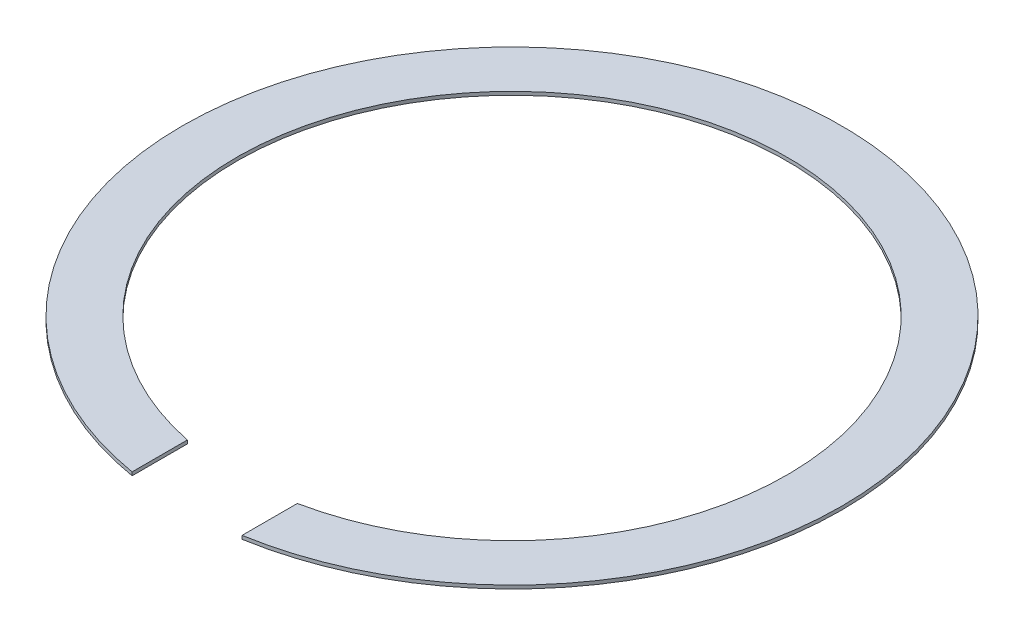
ISO-10303-21;
HEADER;
FILE_DESCRIPTION(('STEP AP214'),'2;1');
FILE_NAME('part.step','',(''),(''),'','','');
FILE_SCHEMA(('AUTOMOTIVE_DESIGN { 1 0 10303 214 1 1 1 1 }'));
ENDSEC;
DATA;
#1=APPLICATION_CONTEXT('core data for automotive mechanical design processes');
#2=APPLICATION_PROTOCOL_DEFINITION('international standard','automotive_design',2000,#1);
#3=PRODUCT_CONTEXT('',#1,'mechanical');
#4=PRODUCT('Part','Part','',(#3));
#5=PRODUCT_RELATED_PRODUCT_CATEGORY('part','',(#4));
#6=PRODUCT_DEFINITION_FORMATION('','',#4);
#7=PRODUCT_DEFINITION_CONTEXT('part definition',#1,'design');
#8=PRODUCT_DEFINITION('design','',#6,#7);
#9=PRODUCT_DEFINITION_SHAPE('','',#8);
#10=(LENGTH_UNIT() NAMED_UNIT(*) SI_UNIT(.MILLI.,.METRE.));
#11=(NAMED_UNIT(*) PLANE_ANGLE_UNIT() SI_UNIT($,.RADIAN.));
#12=(NAMED_UNIT(*) SI_UNIT($,.STERADIAN.) SOLID_ANGLE_UNIT());
#13=UNCERTAINTY_MEASURE_WITH_UNIT(LENGTH_MEASURE(1.E-05),#10,'distance_accuracy_value','');
#14=(GEOMETRIC_REPRESENTATION_CONTEXT(3) GLOBAL_UNCERTAINTY_ASSIGNED_CONTEXT((#13)) GLOBAL_UNIT_ASSIGNED_CONTEXT((#10,
#11,#12)) REPRESENTATION_CONTEXT('',''));
#15=CARTESIAN_POINT('',(0.,0.,0.));
#16=DIRECTION('',(0.,0.,1.));
#17=DIRECTION('',(1.,0.,0.));
#18=AXIS2_PLACEMENT_3D('',#15,#16,#17);
#19=CARTESIAN_POINT('',(0.,1.6002,0.));
#20=DIRECTION('',(0.,1.,0.));
#21=DIRECTION('',(0.,0.,1.));
#22=AXIS2_PLACEMENT_3D('',#19,#20,#21);
#23=PLANE('',#22);
#24=DIRECTION('',(0.,0.,-1.));
#25=VECTOR('',#24,1.);
#26=CARTESIAN_POINT('',(-25.6911112459704,1.6002,151.829236180646));
#27=LINE('',#26,#25);
#28=CARTESIAN_POINT('',(-25.6911112459694,1.6002,125.994888623298));
#29=VERTEX_POINT('',#28);
#30=CARTESIAN_POINT('',(-25.6911112459704,1.6002,151.829236180644));
#31=VERTEX_POINT('',#30);
#32=EDGE_CURVE('E69',#29,#31,#27,.F.);
#33=ORIENTED_EDGE('',*,*,#32,.F.);
#34=CARTESIAN_POINT('',(0.,1.6002,0.));
#35=DIRECTION('',(0.,1.,0.));
#36=DIRECTION('',(0.,0.,1.));
#37=AXIS2_PLACEMENT_3D('',#34,#35,#36);
#38=CIRCLE('',#37,128.5875);
#39=CARTESIAN_POINT('',(25.6911112459704,1.6002,125.994888623303));
#40=VERTEX_POINT('',#39);
#41=EDGE_CURVE('E91',#29,#40,#38,.F.);
#42=ORIENTED_EDGE('',*,*,#41,.T.);
#43=DIRECTION('',(0.,0.,1.));
#44=VECTOR('',#43,1.);
#45=CARTESIAN_POINT('',(25.6911112459704,1.6002,125.994888623308));
#46=LINE('',#45,#44);
#47=CARTESIAN_POINT('',(25.6911112459704,1.6002,151.829236180644));
#48=VERTEX_POINT('',#47);
#49=EDGE_CURVE('E83',#48,#40,#46,.F.);
#50=ORIENTED_EDGE('',*,*,#49,.F.);
#51=CARTESIAN_POINT('',(0.,1.6002,0.));
#52=DIRECTION('',(0.,1.,0.));
#53=DIRECTION('',(0.,0.,1.));
#54=AXIS2_PLACEMENT_3D('',#51,#52,#53);
#55=CIRCLE('',#54,153.9875);
#56=EDGE_CURVE('E36',#31,#48,#55,.F.);
#57=ORIENTED_EDGE('',*,*,#56,.F.);
#58=EDGE_LOOP('',(#33,#42,#50,#57));
#59=FACE_BOUND('',#58,.T.);
#60=ADVANCED_FACE('F33',(#59),#23,.T.);
#61=CARTESIAN_POINT('',(0.,0.,0.));
#62=DIRECTION('',(0.,1.,0.));
#63=DIRECTION('',(0.,0.,1.));
#64=AXIS2_PLACEMENT_3D('',#61,#62,#63);
#65=CYLINDRICAL_SURFACE('',#64,153.9875);
#66=ORIENTED_EDGE('',*,*,#56,.T.);
#67=DIRECTION('',(0.,1.,0.));
#68=VECTOR('',#67,1.);
#69=CARTESIAN_POINT('',(25.6911112459704,0.,151.829236180646));
#70=LINE('',#69,#68);
#71=CARTESIAN_POINT('',(25.6911112459704,0.,151.829236180644));
#72=VERTEX_POINT('',#71);
#73=EDGE_CURVE('E95',#72,#48,#70,.T.);
#74=ORIENTED_EDGE('',*,*,#73,.F.);
#75=CARTESIAN_POINT('',(0.,0.,0.));
#76=DIRECTION('',(0.,1.,0.));
#77=DIRECTION('',(0.,0.,1.));
#78=AXIS2_PLACEMENT_3D('',#75,#76,#77);
#79=CIRCLE('',#78,153.9875);
#80=CARTESIAN_POINT('',(-25.6911112459704,0.,151.829236180644));
#81=VERTEX_POINT('',#80);
#82=EDGE_CURVE('E89',#72,#81,#79,.T.);
#83=ORIENTED_EDGE('',*,*,#82,.T.);
#84=DIRECTION('',(0.,1.,0.));
#85=VECTOR('',#84,1.);
#86=CARTESIAN_POINT('',(-25.6911112459704,0.,151.829236180646));
#87=LINE('',#86,#85);
#88=EDGE_CURVE('E74',#31,#81,#87,.F.);
#89=ORIENTED_EDGE('',*,*,#88,.F.);
#90=EDGE_LOOP('',(#66,#74,#83,#89));
#91=FACE_BOUND('',#90,.T.);
#92=ADVANCED_FACE('F88',(#91),#65,.T.);
#93=CARTESIAN_POINT('',(-25.6911112459704,0.,151.829236180646));
#94=DIRECTION('',(1.,0.,0.));
#95=DIRECTION('',(0.,0.,-1.));
#96=AXIS2_PLACEMENT_3D('',#93,#94,#95);
#97=PLANE('',#96);
#98=ORIENTED_EDGE('',*,*,#32,.T.);
#99=ORIENTED_EDGE('',*,*,#88,.T.);
#100=DIRECTION('',(0.,0.,1.));
#101=VECTOR('',#100,1.);
#102=CARTESIAN_POINT('',(-25.6911112459704,0.,0.));
#103=LINE('',#102,#101);
#104=CARTESIAN_POINT('',(-25.6911112459694,0.,125.994888623298));
#105=VERTEX_POINT('',#104);
#106=EDGE_CURVE('E99',#81,#105,#103,.F.);
#107=ORIENTED_EDGE('',*,*,#106,.T.);
#108=DIRECTION('',(0.,1.,0.));
#109=VECTOR('',#108,1.);
#110=CARTESIAN_POINT('',(-25.6911112459685,0.,125.994888623298));
#111=LINE('',#110,#109);
#112=EDGE_CURVE('E76',#105,#29,#111,.T.);
#113=ORIENTED_EDGE('',*,*,#112,.T.);
#114=EDGE_LOOP('',(#98,#99,#107,#113));
#115=FACE_BOUND('',#114,.T.);
#116=ADVANCED_FACE('F71',(#115),#97,.T.);
#117=CARTESIAN_POINT('',(0.,0.,0.));
#118=DIRECTION('',(0.,1.,0.));
#119=DIRECTION('',(0.,0.,1.));
#120=AXIS2_PLACEMENT_3D('',#117,#118,#119);
#121=CYLINDRICAL_SURFACE('',#120,128.5875);
#122=DIRECTION('',(0.,1.,0.));
#123=VECTOR('',#122,1.);
#124=CARTESIAN_POINT('',(25.6911112459704,0.,125.994888623308));
#125=LINE('',#124,#123);
#126=CARTESIAN_POINT('',(25.6911112459704,0.,125.994888623303));
#127=VERTEX_POINT('',#126);
#128=EDGE_CURVE('E50',#40,#127,#125,.F.);
#129=ORIENTED_EDGE('',*,*,#128,.F.);
#130=ORIENTED_EDGE('',*,*,#41,.F.);
#131=ORIENTED_EDGE('',*,*,#112,.F.);
#132=CARTESIAN_POINT('',(0.,0.,0.));
#133=DIRECTION('',(0.,1.,0.));
#134=DIRECTION('',(0.,0.,1.));
#135=AXIS2_PLACEMENT_3D('',#132,#133,#134);
#136=CIRCLE('',#135,128.5875);
#137=EDGE_CURVE('E42',#105,#127,#136,.F.);
#138=ORIENTED_EDGE('',*,*,#137,.T.);
#139=EDGE_LOOP('',(#129,#130,#131,#138));
#140=FACE_BOUND('',#139,.T.);
#141=ADVANCED_FACE('F106',(#140),#121,.F.);
#142=CARTESIAN_POINT('',(25.6911112459704,0.,125.994888623308));
#143=DIRECTION('',(-1.,0.,0.));
#144=DIRECTION('',(0.,0.,1.));
#145=AXIS2_PLACEMENT_3D('',#142,#143,#144);
#146=PLANE('',#145);
#147=ORIENTED_EDGE('',*,*,#49,.T.);
#148=ORIENTED_EDGE('',*,*,#128,.T.);
#149=DIRECTION('',(0.,0.,1.));
#150=VECTOR('',#149,1.);
#151=CARTESIAN_POINT('',(25.6911112459704,0.,0.));
#152=LINE('',#151,#150);
#153=EDGE_CURVE('E11',#127,#72,#152,.T.);
#154=ORIENTED_EDGE('',*,*,#153,.T.);
#155=ORIENTED_EDGE('',*,*,#73,.T.);
#156=EDGE_LOOP('',(#147,#148,#154,#155));
#157=FACE_BOUND('',#156,.T.);
#158=ADVANCED_FACE('F108',(#157),#146,.T.);
#159=CARTESIAN_POINT('',(0.,0.,0.));
#160=DIRECTION('',(0.,1.,0.));
#161=DIRECTION('',(0.,0.,1.));
#162=AXIS2_PLACEMENT_3D('',#159,#160,#161);
#163=PLANE('',#162);
#164=ORIENTED_EDGE('',*,*,#137,.F.);
#165=ORIENTED_EDGE('',*,*,#106,.F.);
#166=ORIENTED_EDGE('',*,*,#82,.F.);
#167=ORIENTED_EDGE('',*,*,#153,.F.);
#168=EDGE_LOOP('',(#164,#165,#166,#167));
#169=FACE_BOUND('',#168,.T.);
#170=ADVANCED_FACE('F104',(#169),#163,.F.);
#171=CLOSED_SHELL('',(#60,#92,#116,#141,#158,#170));
#172=MANIFOLD_SOLID_BREP('B2',#171);
#173=ADVANCED_BREP_SHAPE_REPRESENTATION('',(#18,#172),#14);
#174=SHAPE_DEFINITION_REPRESENTATION(#9,#173);
ENDSEC;
END-ISO-10303-21;
